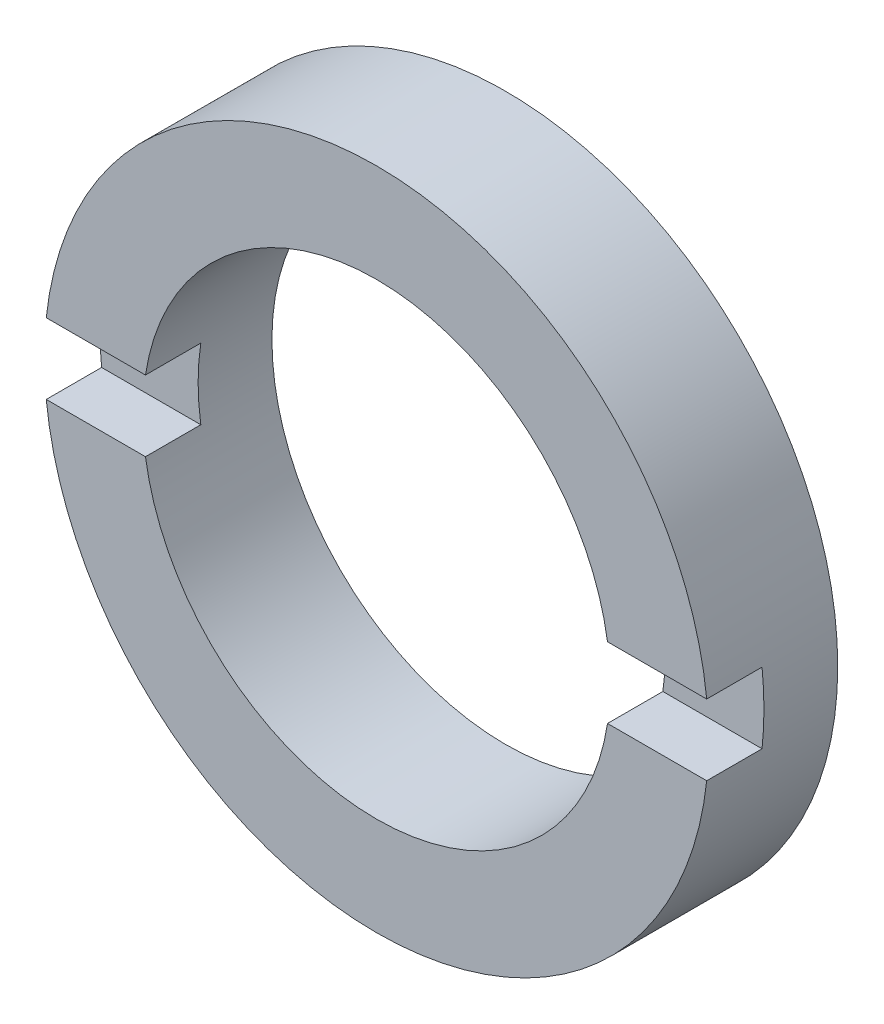
ISO-10303-21;
HEADER;
FILE_DESCRIPTION(('STEP AP214'),'2;1');
FILE_NAME('part.step','',(''),(''),'','','');
FILE_SCHEMA(('AUTOMOTIVE_DESIGN { 1 0 10303 214 1 1 1 1 }'));
ENDSEC;
DATA;
#1=APPLICATION_CONTEXT('core data for automotive mechanical design processes');
#2=APPLICATION_PROTOCOL_DEFINITION('international standard','automotive_design',2000,#1);
#3=PRODUCT_CONTEXT('',#1,'mechanical');
#4=PRODUCT('Part','Part','',(#3));
#5=PRODUCT_RELATED_PRODUCT_CATEGORY('part','',(#4));
#6=PRODUCT_DEFINITION_FORMATION('','',#4);
#7=PRODUCT_DEFINITION_CONTEXT('part definition',#1,'design');
#8=PRODUCT_DEFINITION('design','',#6,#7);
#9=PRODUCT_DEFINITION_SHAPE('','',#8);
#10=(LENGTH_UNIT() NAMED_UNIT(*) SI_UNIT(.MILLI.,.METRE.));
#11=(NAMED_UNIT(*) PLANE_ANGLE_UNIT() SI_UNIT($,.RADIAN.));
#12=(NAMED_UNIT(*) SI_UNIT($,.STERADIAN.) SOLID_ANGLE_UNIT());
#13=UNCERTAINTY_MEASURE_WITH_UNIT(LENGTH_MEASURE(1.E-05),#10,'distance_accuracy_value','');
#14=(GEOMETRIC_REPRESENTATION_CONTEXT(3) GLOBAL_UNCERTAINTY_ASSIGNED_CONTEXT((#13)) GLOBAL_UNIT_ASSIGNED_CONTEXT((#10,
#11,#12)) REPRESENTATION_CONTEXT('',''));
#15=CARTESIAN_POINT('',(0.,0.,0.));
#16=DIRECTION('',(0.,0.,1.));
#17=DIRECTION('',(1.,0.,0.));
#18=AXIS2_PLACEMENT_3D('',#15,#16,#17);
#19=CARTESIAN_POINT('',(0.,0.,4.2));
#20=DIRECTION('',(0.,0.,-1.));
#21=DIRECTION('',(0.,-1.,0.));
#22=AXIS2_PLACEMENT_3D('',#19,#20,#21);
#23=CYLINDRICAL_SURFACE('',#22,7.6);
#24=CARTESIAN_POINT('',(0.,0.,0.));
#25=DIRECTION('',(0.,0.,1.));
#26=DIRECTION('',(1.,0.,0.));
#27=AXIS2_PLACEMENT_3D('',#24,#25,#26);
#28=CIRCLE('',#27,7.6);
#29=CARTESIAN_POINT('',(7.6,0.,0.));
#30=VERTEX_POINT('',#29);
#31=EDGE_CURVE('E144',#30,#30,#28,.T.);
#32=ORIENTED_EDGE('',*,*,#31,.F.);
#33=EDGE_LOOP('',(#32));
#34=FACE_BOUND('',#33,.T.);
#35=CARTESIAN_POINT('',(0.,0.,2.4));
#36=DIRECTION('',(0.,0.,1.));
#37=DIRECTION('',(1.,0.,0.));
#38=AXIS2_PLACEMENT_3D('',#35,#36,#37);
#39=CIRCLE('',#38,7.6);
#40=CARTESIAN_POINT('',(7.51248960065836,-1.15,2.4));
#41=VERTEX_POINT('',#40);
#42=CARTESIAN_POINT('',(7.51248960065836,1.15,2.4));
#43=VERTEX_POINT('',#42);
#44=EDGE_CURVE('E11',#41,#43,#39,.T.);
#45=ORIENTED_EDGE('',*,*,#44,.T.);
#46=DIRECTION('',(0.,0.,-1.));
#47=VECTOR('',#46,1.);
#48=CARTESIAN_POINT('',(7.51248960065836,1.15,4.2));
#49=LINE('',#48,#47);
#50=CARTESIAN_POINT('',(7.51248960065836,1.15,4.2));
#51=VERTEX_POINT('',#50);
#52=EDGE_CURVE('E35',#51,#43,#49,.T.);
#53=ORIENTED_EDGE('',*,*,#52,.F.);
#54=CARTESIAN_POINT('',(0.,0.,4.2));
#55=DIRECTION('',(0.,0.,1.));
#56=DIRECTION('',(1.,0.,0.));
#57=AXIS2_PLACEMENT_3D('',#54,#55,#56);
#58=CIRCLE('',#57,7.6);
#59=CARTESIAN_POINT('',(-7.51248960065836,1.15,4.2));
#60=VERTEX_POINT('',#59);
#61=EDGE_CURVE('E26',#51,#60,#58,.T.);
#62=ORIENTED_EDGE('',*,*,#61,.T.);
#63=DIRECTION('',(0.,0.,1.));
#64=VECTOR('',#63,1.);
#65=CARTESIAN_POINT('',(-7.51248960065836,1.15,4.2));
#66=LINE('',#65,#64);
#67=CARTESIAN_POINT('',(-7.51248960065836,1.15,2.4));
#68=VERTEX_POINT('',#67);
#69=EDGE_CURVE('E104',#68,#60,#66,.T.);
#70=ORIENTED_EDGE('',*,*,#69,.F.);
#71=CARTESIAN_POINT('',(0.,0.,2.4));
#72=DIRECTION('',(0.,0.,1.));
#73=DIRECTION('',(1.,0.,0.));
#74=AXIS2_PLACEMENT_3D('',#71,#72,#73);
#75=CIRCLE('',#74,7.6);
#76=CARTESIAN_POINT('',(-7.51248960065836,-1.15,2.4));
#77=VERTEX_POINT('',#76);
#78=EDGE_CURVE('E140',#68,#77,#75,.T.);
#79=ORIENTED_EDGE('',*,*,#78,.T.);
#80=DIRECTION('',(0.,0.,-1.));
#81=VECTOR('',#80,1.);
#82=CARTESIAN_POINT('',(-7.51248960065836,-1.15,4.2));
#83=LINE('',#82,#81);
#84=CARTESIAN_POINT('',(-7.51248960065836,-1.15,4.2));
#85=VERTEX_POINT('',#84);
#86=EDGE_CURVE('E112',#85,#77,#83,.T.);
#87=ORIENTED_EDGE('',*,*,#86,.F.);
#88=CARTESIAN_POINT('',(0.,0.,4.2));
#89=DIRECTION('',(0.,0.,1.));
#90=DIRECTION('',(1.,0.,0.));
#91=AXIS2_PLACEMENT_3D('',#88,#89,#90);
#92=CIRCLE('',#91,7.6);
#93=CARTESIAN_POINT('',(7.51248960065836,-1.15,4.2));
#94=VERTEX_POINT('',#93);
#95=EDGE_CURVE('E136',#85,#94,#92,.T.);
#96=ORIENTED_EDGE('',*,*,#95,.T.);
#97=DIRECTION('',(0.,0.,1.));
#98=VECTOR('',#97,1.);
#99=CARTESIAN_POINT('',(7.51248960065836,-1.15,4.2));
#100=LINE('',#99,#98);
#101=EDGE_CURVE('E102',#41,#94,#100,.T.);
#102=ORIENTED_EDGE('',*,*,#101,.F.);
#103=EDGE_LOOP('',(#45,#53,#62,#70,#79,#87,#96,#102));
#104=FACE_BOUND('',#103,.T.);
#105=ADVANCED_FACE('F16',(#34,#104),#23,.F.);
#106=CARTESIAN_POINT('',(0.,0.,4.2));
#107=DIRECTION('',(0.,0.,-1.));
#108=DIRECTION('',(0.,-1.,0.));
#109=AXIS2_PLACEMENT_3D('',#106,#107,#108);
#110=CYLINDRICAL_SURFACE('',#109,10.8);
#111=CARTESIAN_POINT('',(0.,0.,2.4));
#112=DIRECTION('',(0.,0.,1.));
#113=DIRECTION('',(1.,0.,0.));
#114=AXIS2_PLACEMENT_3D('',#111,#112,#113);
#115=CIRCLE('',#114,10.8);
#116=CARTESIAN_POINT('',(10.7385986050322,-1.15,2.4));
#117=VERTEX_POINT('',#116);
#118=CARTESIAN_POINT('',(10.7385986050322,1.15,2.4));
#119=VERTEX_POINT('',#118);
#120=EDGE_CURVE('E115',#117,#119,#115,.T.);
#121=ORIENTED_EDGE('',*,*,#120,.F.);
#122=DIRECTION('',(0.,0.,1.));
#123=VECTOR('',#122,1.);
#124=CARTESIAN_POINT('',(10.7385986050322,-1.15,4.2));
#125=LINE('',#124,#123);
#126=CARTESIAN_POINT('',(10.7385986050322,-1.15,4.2));
#127=VERTEX_POINT('',#126);
#128=EDGE_CURVE('E133',#117,#127,#125,.T.);
#129=ORIENTED_EDGE('',*,*,#128,.T.);
#130=CARTESIAN_POINT('',(0.,0.,4.2));
#131=DIRECTION('',(0.,0.,1.));
#132=DIRECTION('',(1.,0.,0.));
#133=AXIS2_PLACEMENT_3D('',#130,#131,#132);
#134=CIRCLE('',#133,10.8);
#135=CARTESIAN_POINT('',(-10.7385986050322,-1.15,4.2));
#136=VERTEX_POINT('',#135);
#137=EDGE_CURVE('E89',#136,#127,#134,.T.);
#138=ORIENTED_EDGE('',*,*,#137,.F.);
#139=DIRECTION('',(0.,0.,-1.));
#140=VECTOR('',#139,1.);
#141=CARTESIAN_POINT('',(-10.7385986050322,-1.15,4.2));
#142=LINE('',#141,#140);
#143=CARTESIAN_POINT('',(-10.7385986050322,-1.15,2.4));
#144=VERTEX_POINT('',#143);
#145=EDGE_CURVE('E131',#136,#144,#142,.T.);
#146=ORIENTED_EDGE('',*,*,#145,.T.);
#147=CARTESIAN_POINT('',(0.,0.,2.4));
#148=DIRECTION('',(0.,0.,1.));
#149=DIRECTION('',(1.,0.,0.));
#150=AXIS2_PLACEMENT_3D('',#147,#148,#149);
#151=CIRCLE('',#150,10.8);
#152=CARTESIAN_POINT('',(-10.7385986050322,1.15,2.4));
#153=VERTEX_POINT('',#152);
#154=EDGE_CURVE('E124',#153,#144,#151,.T.);
#155=ORIENTED_EDGE('',*,*,#154,.F.);
#156=DIRECTION('',(0.,0.,1.));
#157=VECTOR('',#156,1.);
#158=CARTESIAN_POINT('',(-10.7385986050322,1.15,4.2));
#159=LINE('',#158,#157);
#160=CARTESIAN_POINT('',(-10.7385986050322,1.15,4.2));
#161=VERTEX_POINT('',#160);
#162=EDGE_CURVE('E86',#153,#161,#159,.T.);
#163=ORIENTED_EDGE('',*,*,#162,.T.);
#164=CARTESIAN_POINT('',(0.,0.,4.2));
#165=DIRECTION('',(0.,0.,1.));
#166=DIRECTION('',(1.,0.,0.));
#167=AXIS2_PLACEMENT_3D('',#164,#165,#166);
#168=CIRCLE('',#167,10.8);
#169=CARTESIAN_POINT('',(10.7385986050322,1.15,4.2));
#170=VERTEX_POINT('',#169);
#171=EDGE_CURVE('E78',#170,#161,#168,.T.);
#172=ORIENTED_EDGE('',*,*,#171,.F.);
#173=DIRECTION('',(0.,0.,-1.));
#174=VECTOR('',#173,1.);
#175=CARTESIAN_POINT('',(10.7385986050322,1.15,4.2));
#176=LINE('',#175,#174);
#177=EDGE_CURVE('E84',#170,#119,#176,.T.);
#178=ORIENTED_EDGE('',*,*,#177,.T.);
#179=EDGE_LOOP('',(#121,#129,#138,#146,#155,#163,#172,#178));
#180=FACE_BOUND('',#179,.T.);
#181=CARTESIAN_POINT('',(0.,0.,0.));
#182=DIRECTION('',(0.,0.,1.));
#183=DIRECTION('',(1.,0.,0.));
#184=AXIS2_PLACEMENT_3D('',#181,#182,#183);
#185=CIRCLE('',#184,10.8);
#186=CARTESIAN_POINT('',(10.8,0.,0.));
#187=VERTEX_POINT('',#186);
#188=EDGE_CURVE('E88',#187,#187,#185,.T.);
#189=ORIENTED_EDGE('',*,*,#188,.T.);
#190=EDGE_LOOP('',(#189));
#191=FACE_BOUND('',#190,.T.);
#192=ADVANCED_FACE('F18',(#180,#191),#110,.T.);
#193=CARTESIAN_POINT('',(0.,0.,4.2));
#194=DIRECTION('',(0.,0.,1.));
#195=DIRECTION('',(1.,0.,0.));
#196=AXIS2_PLACEMENT_3D('',#193,#194,#195);
#197=PLANE('',#196);
#198=DIRECTION('',(-1.,0.,0.));
#199=VECTOR('',#198,1.);
#200=CARTESIAN_POINT('',(14.,1.15,4.2));
#201=LINE('',#200,#199);
#202=EDGE_CURVE('E92',#170,#51,#201,.T.);
#203=ORIENTED_EDGE('',*,*,#202,.F.);
#204=ORIENTED_EDGE('',*,*,#171,.T.);
#205=DIRECTION('',(-1.,0.,0.));
#206=VECTOR('',#205,1.);
#207=CARTESIAN_POINT('',(14.,1.15,4.2));
#208=LINE('',#207,#206);
#209=EDGE_CURVE('E108',#60,#161,#208,.T.);
#210=ORIENTED_EDGE('',*,*,#209,.F.);
#211=ORIENTED_EDGE('',*,*,#61,.F.);
#212=EDGE_LOOP('',(#203,#204,#210,#211));
#213=FACE_BOUND('',#212,.T.);
#214=ADVANCED_FACE('F97',(#213),#197,.T.);
#215=CARTESIAN_POINT('',(0.,0.,4.2));
#216=DIRECTION('',(0.,0.,1.));
#217=DIRECTION('',(1.,0.,0.));
#218=AXIS2_PLACEMENT_3D('',#215,#216,#217);
#219=PLANE('',#218);
#220=DIRECTION('',(1.,0.,0.));
#221=VECTOR('',#220,1.);
#222=CARTESIAN_POINT('',(14.,-1.15,4.2));
#223=LINE('',#222,#221);
#224=EDGE_CURVE('E110',#136,#85,#223,.T.);
#225=ORIENTED_EDGE('',*,*,#224,.F.);
#226=ORIENTED_EDGE('',*,*,#137,.T.);
#227=DIRECTION('',(1.,0.,0.));
#228=VECTOR('',#227,1.);
#229=CARTESIAN_POINT('',(14.,-1.15,4.2));
#230=LINE('',#229,#228);
#231=EDGE_CURVE('E99',#94,#127,#230,.T.);
#232=ORIENTED_EDGE('',*,*,#231,.F.);
#233=ORIENTED_EDGE('',*,*,#95,.F.);
#234=EDGE_LOOP('',(#225,#226,#232,#233));
#235=FACE_BOUND('',#234,.T.);
#236=ADVANCED_FACE('F163',(#235),#219,.T.);
#237=CARTESIAN_POINT('',(0.,0.,0.));
#238=DIRECTION('',(0.,0.,1.));
#239=DIRECTION('',(1.,0.,0.));
#240=AXIS2_PLACEMENT_3D('',#237,#238,#239);
#241=PLANE('',#240);
#242=ORIENTED_EDGE('',*,*,#188,.F.);
#243=EDGE_LOOP('',(#242));
#244=FACE_BOUND('',#243,.T.);
#245=ORIENTED_EDGE('',*,*,#31,.T.);
#246=EDGE_LOOP('',(#245));
#247=FACE_BOUND('',#246,.T.);
#248=ADVANCED_FACE('F165',(#244,#247),#241,.F.);
#249=CARTESIAN_POINT('',(0.,0.,2.4));
#250=DIRECTION('',(0.,0.,1.));
#251=DIRECTION('',(1.,0.,0.));
#252=AXIS2_PLACEMENT_3D('',#249,#250,#251);
#253=PLANE('',#252);
#254=ORIENTED_EDGE('',*,*,#120,.T.);
#255=DIRECTION('',(-1.,0.,0.));
#256=VECTOR('',#255,1.);
#257=CARTESIAN_POINT('',(14.,1.15,2.4));
#258=LINE('',#257,#256);
#259=EDGE_CURVE('E94',#119,#43,#258,.T.);
#260=ORIENTED_EDGE('',*,*,#259,.T.);
#261=ORIENTED_EDGE('',*,*,#44,.F.);
#262=DIRECTION('',(1.,0.,0.));
#263=VECTOR('',#262,1.);
#264=CARTESIAN_POINT('',(14.,-1.15,2.4));
#265=LINE('',#264,#263);
#266=EDGE_CURVE('E116',#41,#117,#265,.T.);
#267=ORIENTED_EDGE('',*,*,#266,.T.);
#268=EDGE_LOOP('',(#254,#260,#261,#267));
#269=FACE_BOUND('',#268,.T.);
#270=ADVANCED_FACE('F172',(#269),#253,.T.);
#271=CARTESIAN_POINT('',(14.,-1.15,2.4));
#272=DIRECTION('',(0.,-1.,0.));
#273=DIRECTION('',(1.,0.,0.));
#274=AXIS2_PLACEMENT_3D('',#271,#272,#273);
#275=PLANE('',#274);
#276=ORIENTED_EDGE('',*,*,#266,.F.);
#277=ORIENTED_EDGE('',*,*,#101,.T.);
#278=ORIENTED_EDGE('',*,*,#231,.T.);
#279=ORIENTED_EDGE('',*,*,#128,.F.);
#280=EDGE_LOOP('',(#276,#277,#278,#279));
#281=FACE_BOUND('',#280,.T.);
#282=ADVANCED_FACE('F159',(#281),#275,.F.);
#283=CARTESIAN_POINT('',(14.,1.15,2.4));
#284=DIRECTION('',(0.,1.,0.));
#285=DIRECTION('',(-1.,0.,0.));
#286=AXIS2_PLACEMENT_3D('',#283,#284,#285);
#287=PLANE('',#286);
#288=ORIENTED_EDGE('',*,*,#202,.T.);
#289=ORIENTED_EDGE('',*,*,#52,.T.);
#290=ORIENTED_EDGE('',*,*,#259,.F.);
#291=ORIENTED_EDGE('',*,*,#177,.F.);
#292=EDGE_LOOP('',(#288,#289,#290,#291));
#293=FACE_BOUND('',#292,.T.);
#294=ADVANCED_FACE('F91',(#293),#287,.F.);
#295=CARTESIAN_POINT('',(14.,1.15,2.4));
#296=DIRECTION('',(0.,1.,0.));
#297=DIRECTION('',(-1.,0.,0.));
#298=AXIS2_PLACEMENT_3D('',#295,#296,#297);
#299=PLANE('',#298);
#300=DIRECTION('',(-1.,0.,0.));
#301=VECTOR('',#300,1.);
#302=CARTESIAN_POINT('',(14.,1.15,2.4));
#303=LINE('',#302,#301);
#304=EDGE_CURVE('E118',#68,#153,#303,.T.);
#305=ORIENTED_EDGE('',*,*,#304,.F.);
#306=ORIENTED_EDGE('',*,*,#69,.T.);
#307=ORIENTED_EDGE('',*,*,#209,.T.);
#308=ORIENTED_EDGE('',*,*,#162,.F.);
#309=EDGE_LOOP('',(#305,#306,#307,#308));
#310=FACE_BOUND('',#309,.T.);
#311=ADVANCED_FACE('F188',(#310),#299,.F.);
#312=CARTESIAN_POINT('',(14.,-1.15,2.4));
#313=DIRECTION('',(0.,-1.,0.));
#314=DIRECTION('',(1.,0.,0.));
#315=AXIS2_PLACEMENT_3D('',#312,#313,#314);
#316=PLANE('',#315);
#317=ORIENTED_EDGE('',*,*,#224,.T.);
#318=ORIENTED_EDGE('',*,*,#86,.T.);
#319=DIRECTION('',(1.,0.,0.));
#320=VECTOR('',#319,1.);
#321=CARTESIAN_POINT('',(14.,-1.15,2.4));
#322=LINE('',#321,#320);
#323=EDGE_CURVE('E20',#144,#77,#322,.T.);
#324=ORIENTED_EDGE('',*,*,#323,.F.);
#325=ORIENTED_EDGE('',*,*,#145,.F.);
#326=EDGE_LOOP('',(#317,#318,#324,#325));
#327=FACE_BOUND('',#326,.T.);
#328=ADVANCED_FACE('F185',(#327),#316,.F.);
#329=CARTESIAN_POINT('',(0.,0.,2.4));
#330=DIRECTION('',(0.,0.,1.));
#331=DIRECTION('',(1.,0.,0.));
#332=AXIS2_PLACEMENT_3D('',#329,#330,#331);
#333=PLANE('',#332);
#334=ORIENTED_EDGE('',*,*,#154,.T.);
#335=ORIENTED_EDGE('',*,*,#323,.T.);
#336=ORIENTED_EDGE('',*,*,#78,.F.);
#337=ORIENTED_EDGE('',*,*,#304,.T.);
#338=EDGE_LOOP('',(#334,#335,#336,#337));
#339=FACE_BOUND('',#338,.T.);
#340=ADVANCED_FACE('F182',(#339),#333,.T.);
#341=CLOSED_SHELL('',(#105,#192,#214,#236,#248,#270,#282,#294,#311,#328,#340));
#342=MANIFOLD_SOLID_BREP('B1',#341);
#343=ADVANCED_BREP_SHAPE_REPRESENTATION('',(#18,#342),#14);
#344=SHAPE_DEFINITION_REPRESENTATION(#9,#343);
ENDSEC;
END-ISO-10303-21;
